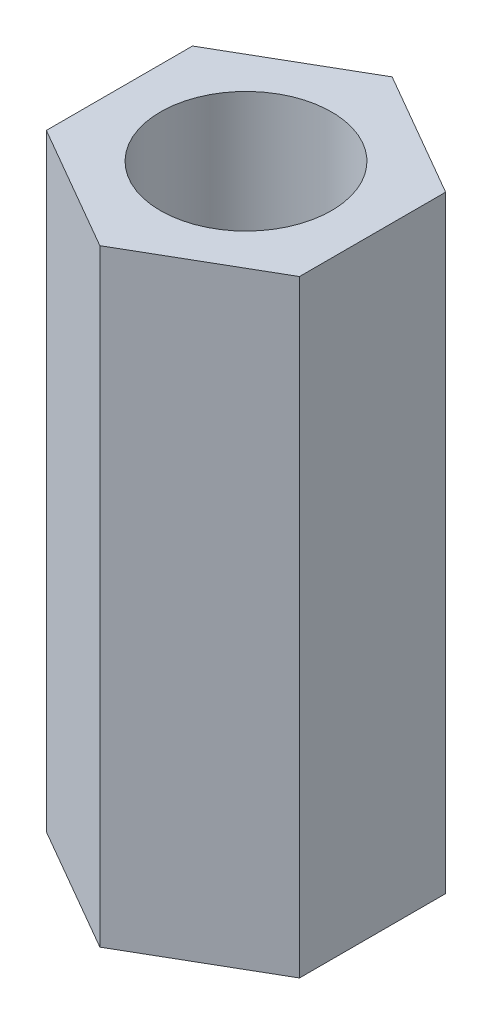
ISO-10303-21;
HEADER;
FILE_DESCRIPTION(('STEP AP214'),'2;1');
FILE_NAME('part.step','',(''),(''),'','','');
FILE_SCHEMA(('AUTOMOTIVE_DESIGN { 1 0 10303 214 1 1 1 1 }'));
ENDSEC;
DATA;
#1=APPLICATION_CONTEXT('core data for automotive mechanical design processes');
#2=APPLICATION_PROTOCOL_DEFINITION('international standard','automotive_design',2000,#1);
#3=PRODUCT_CONTEXT('',#1,'mechanical');
#4=PRODUCT('Part','Part','',(#3));
#5=PRODUCT_RELATED_PRODUCT_CATEGORY('part','',(#4));
#6=PRODUCT_DEFINITION_FORMATION('','',#4);
#7=PRODUCT_DEFINITION_CONTEXT('part definition',#1,'design');
#8=PRODUCT_DEFINITION('design','',#6,#7);
#9=PRODUCT_DEFINITION_SHAPE('','',#8);
#10=(LENGTH_UNIT() NAMED_UNIT(*) SI_UNIT(.MILLI.,.METRE.));
#11=(NAMED_UNIT(*) PLANE_ANGLE_UNIT() SI_UNIT($,.RADIAN.));
#12=(NAMED_UNIT(*) SI_UNIT($,.STERADIAN.) SOLID_ANGLE_UNIT());
#13=UNCERTAINTY_MEASURE_WITH_UNIT(LENGTH_MEASURE(1.E-05),#10,'distance_accuracy_value','');
#14=(GEOMETRIC_REPRESENTATION_CONTEXT(3) GLOBAL_UNCERTAINTY_ASSIGNED_CONTEXT((#13)) GLOBAL_UNIT_ASSIGNED_CONTEXT((#10,
#11,#12)) REPRESENTATION_CONTEXT('',''));
#15=CARTESIAN_POINT('',(0.,0.,0.));
#16=DIRECTION('',(0.,0.,1.));
#17=DIRECTION('',(1.,0.,0.));
#18=AXIS2_PLACEMENT_3D('',#15,#16,#17);
#19=CARTESIAN_POINT('',(0.,12.,0.));
#20=DIRECTION('',(0.,-1.,0.));
#21=DIRECTION('',(0.,0.,-1.));
#22=AXIS2_PLACEMENT_3D('',#19,#20,#21);
#23=PLANE('',#22);
#24=DIRECTION('',(-0.866025403784439,0.,0.5));
#25=VECTOR('',#24,1.);
#26=CARTESIAN_POINT('',(-2.50021534072567,12.,-1.4435));
#27=LINE('',#26,#25);
#28=CARTESIAN_POINT('',(0.,12.,-2.887));
#29=VERTEX_POINT('',#28);
#30=CARTESIAN_POINT('',(-2.50021534072567,12.,-1.4435));
#31=VERTEX_POINT('',#30);
#32=EDGE_CURVE('E129',#29,#31,#27,.T.);
#33=ORIENTED_EDGE('',*,*,#32,.T.);
#34=DIRECTION('',(0.,0.,1.));
#35=VECTOR('',#34,1.);
#36=CARTESIAN_POINT('',(-2.50021534072567,12.,1.4435));
#37=LINE('',#36,#35);
#38=CARTESIAN_POINT('',(-2.50021534072567,12.,1.4435));
#39=VERTEX_POINT('',#38);
#40=EDGE_CURVE('E87',#31,#39,#37,.T.);
#41=ORIENTED_EDGE('',*,*,#40,.T.);
#42=DIRECTION('',(0.866025403784439,0.,0.5));
#43=VECTOR('',#42,1.);
#44=CARTESIAN_POINT('',(0.,12.,2.887));
#45=LINE('',#44,#43);
#46=CARTESIAN_POINT('',(0.,12.,2.887));
#47=VERTEX_POINT('',#46);
#48=EDGE_CURVE('E100',#39,#47,#45,.T.);
#49=ORIENTED_EDGE('',*,*,#48,.T.);
#50=DIRECTION('',(0.866025403784439,0.,-0.5));
#51=VECTOR('',#50,1.);
#52=CARTESIAN_POINT('',(2.50021534072567,12.,1.4435));
#53=LINE('',#52,#51);
#54=CARTESIAN_POINT('',(2.50021534072567,12.,1.4435));
#55=VERTEX_POINT('',#54);
#56=EDGE_CURVE('E94',#47,#55,#53,.T.);
#57=ORIENTED_EDGE('',*,*,#56,.T.);
#58=DIRECTION('',(0.,0.,-1.));
#59=VECTOR('',#58,1.);
#60=CARTESIAN_POINT('',(2.50021534072567,12.,-1.4435));
#61=LINE('',#60,#59);
#62=CARTESIAN_POINT('',(2.50021534072567,12.,-1.4435));
#63=VERTEX_POINT('',#62);
#64=EDGE_CURVE('E98',#55,#63,#61,.T.);
#65=ORIENTED_EDGE('',*,*,#64,.T.);
#66=DIRECTION('',(-0.866025403784439,0.,-0.5));
#67=VECTOR('',#66,1.);
#68=CARTESIAN_POINT('',(0.,12.,-2.887));
#69=LINE('',#68,#67);
#70=EDGE_CURVE('E50',#63,#29,#69,.T.);
#71=ORIENTED_EDGE('',*,*,#70,.T.);
#72=EDGE_LOOP('',(#33,#41,#49,#57,#65,#71));
#73=FACE_BOUND('',#72,.T.);
#74=CARTESIAN_POINT('',(0.,12.,0.));
#75=DIRECTION('',(0.,1.,0.));
#76=DIRECTION('',(0.,0.,1.));
#77=AXIS2_PLACEMENT_3D('',#74,#75,#76);
#78=CIRCLE('',#77,1.69);
#79=CARTESIAN_POINT('',(0.,12.,1.69));
#80=VERTEX_POINT('',#79);
#81=EDGE_CURVE('E122',#80,#80,#78,.T.);
#82=ORIENTED_EDGE('',*,*,#81,.F.);
#83=EDGE_LOOP('',(#82));
#84=FACE_BOUND('',#83,.T.);
#85=ADVANCED_FACE('F33',(#73,#84),#23,.F.);
#86=CARTESIAN_POINT('',(0.,0.,0.));
#87=DIRECTION('',(0.,-1.,0.));
#88=DIRECTION('',(0.,0.,-1.));
#89=AXIS2_PLACEMENT_3D('',#86,#87,#88);
#90=PLANE('',#89);
#91=DIRECTION('',(-0.866025403784439,0.,0.5));
#92=VECTOR('',#91,1.);
#93=CARTESIAN_POINT('',(-2.50021534072567,0.,-1.4435));
#94=LINE('',#93,#92);
#95=CARTESIAN_POINT('',(0.,0.,-2.887));
#96=VERTEX_POINT('',#95);
#97=CARTESIAN_POINT('',(-2.50021534072567,0.,-1.4435));
#98=VERTEX_POINT('',#97);
#99=EDGE_CURVE('E118',#96,#98,#94,.T.);
#100=ORIENTED_EDGE('',*,*,#99,.F.);
#101=DIRECTION('',(-0.866025403784439,0.,-0.5));
#102=VECTOR('',#101,1.);
#103=CARTESIAN_POINT('',(0.,0.,-2.887));
#104=LINE('',#103,#102);
#105=CARTESIAN_POINT('',(2.50021534072567,0.,-1.4435));
#106=VERTEX_POINT('',#105);
#107=EDGE_CURVE('E79',#106,#96,#104,.T.);
#108=ORIENTED_EDGE('',*,*,#107,.F.);
#109=DIRECTION('',(0.,0.,-1.));
#110=VECTOR('',#109,1.);
#111=CARTESIAN_POINT('',(2.50021534072567,0.,-1.4435));
#112=LINE('',#111,#110);
#113=CARTESIAN_POINT('',(2.50021534072567,0.,1.4435));
#114=VERTEX_POINT('',#113);
#115=EDGE_CURVE('E73',#114,#106,#112,.T.);
#116=ORIENTED_EDGE('',*,*,#115,.F.);
#117=DIRECTION('',(0.866025403784439,0.,-0.5));
#118=VECTOR('',#117,1.);
#119=CARTESIAN_POINT('',(2.50021534072567,0.,1.4435));
#120=LINE('',#119,#118);
#121=CARTESIAN_POINT('',(0.,0.,2.887));
#122=VERTEX_POINT('',#121);
#123=EDGE_CURVE('E108',#122,#114,#120,.T.);
#124=ORIENTED_EDGE('',*,*,#123,.F.);
#125=DIRECTION('',(0.866025403784439,0.,0.5));
#126=VECTOR('',#125,1.);
#127=CARTESIAN_POINT('',(0.,0.,2.887));
#128=LINE('',#127,#126);
#129=CARTESIAN_POINT('',(-2.50021534072567,0.,1.4435));
#130=VERTEX_POINT('',#129);
#131=EDGE_CURVE('E124',#130,#122,#128,.T.);
#132=ORIENTED_EDGE('',*,*,#131,.F.);
#133=DIRECTION('',(0.,0.,1.));
#134=VECTOR('',#133,1.);
#135=CARTESIAN_POINT('',(-2.50021534072567,0.,1.4435));
#136=LINE('',#135,#134);
#137=EDGE_CURVE('E121',#98,#130,#136,.T.);
#138=ORIENTED_EDGE('',*,*,#137,.F.);
#139=EDGE_LOOP('',(#100,#108,#116,#124,#132,#138));
#140=FACE_BOUND('',#139,.T.);
#141=CARTESIAN_POINT('',(0.,0.,0.));
#142=DIRECTION('',(0.,1.,0.));
#143=DIRECTION('',(0.,0.,1.));
#144=AXIS2_PLACEMENT_3D('',#141,#142,#143);
#145=CIRCLE('',#144,1.69);
#146=CARTESIAN_POINT('',(0.,0.,1.69));
#147=VERTEX_POINT('',#146);
#148=EDGE_CURVE('E222',#147,#147,#145,.T.);
#149=ORIENTED_EDGE('',*,*,#148,.T.);
#150=EDGE_LOOP('',(#149));
#151=FACE_BOUND('',#150,.T.);
#152=ADVANCED_FACE('F138',(#140,#151),#90,.T.);
#153=CARTESIAN_POINT('',(-2.50021534072567,12.,-1.4435));
#154=DIRECTION('',(0.5,0.,0.866025403784439));
#155=DIRECTION('',(0.866025403784439,0.,-0.5));
#156=AXIS2_PLACEMENT_3D('',#153,#154,#155);
#157=PLANE('',#156);
#158=ORIENTED_EDGE('',*,*,#99,.T.);
#159=DIRECTION('',(0.,-1.,0.));
#160=VECTOR('',#159,1.);
#161=CARTESIAN_POINT('',(-2.50021534072567,12.,-1.4435));
#162=LINE('',#161,#160);
#163=EDGE_CURVE('E11',#31,#98,#162,.T.);
#164=ORIENTED_EDGE('',*,*,#163,.F.);
#165=ORIENTED_EDGE('',*,*,#32,.F.);
#166=DIRECTION('',(0.,-1.,0.));
#167=VECTOR('',#166,1.);
#168=CARTESIAN_POINT('',(0.,12.,-2.887));
#169=LINE('',#168,#167);
#170=EDGE_CURVE('E114',#29,#96,#169,.T.);
#171=ORIENTED_EDGE('',*,*,#170,.T.);
#172=EDGE_LOOP('',(#158,#164,#165,#171));
#173=FACE_BOUND('',#172,.T.);
#174=ADVANCED_FACE('F35',(#173),#157,.F.);
#175=CARTESIAN_POINT('',(-2.50021534072567,12.,1.4435));
#176=DIRECTION('',(1.,0.,0.));
#177=DIRECTION('',(0.,0.,-1.));
#178=AXIS2_PLACEMENT_3D('',#175,#176,#177);
#179=PLANE('',#178);
#180=ORIENTED_EDGE('',*,*,#137,.T.);
#181=DIRECTION('',(0.,-1.,0.));
#182=VECTOR('',#181,1.);
#183=CARTESIAN_POINT('',(-2.50021534072567,12.,1.4435));
#184=LINE('',#183,#182);
#185=EDGE_CURVE('E42',#39,#130,#184,.T.);
#186=ORIENTED_EDGE('',*,*,#185,.F.);
#187=ORIENTED_EDGE('',*,*,#40,.F.);
#188=ORIENTED_EDGE('',*,*,#163,.T.);
#189=EDGE_LOOP('',(#180,#186,#187,#188));
#190=FACE_BOUND('',#189,.T.);
#191=ADVANCED_FACE('F163',(#190),#179,.F.);
#192=CARTESIAN_POINT('',(0.,12.,2.887));
#193=DIRECTION('',(0.5,0.,-0.866025403784439));
#194=DIRECTION('',(-0.866025403784439,0.,-0.5));
#195=AXIS2_PLACEMENT_3D('',#192,#193,#194);
#196=PLANE('',#195);
#197=ORIENTED_EDGE('',*,*,#131,.T.);
#198=DIRECTION('',(0.,-1.,0.));
#199=VECTOR('',#198,1.);
#200=CARTESIAN_POINT('',(0.,12.,2.887));
#201=LINE('',#200,#199);
#202=EDGE_CURVE('E109',#47,#122,#201,.T.);
#203=ORIENTED_EDGE('',*,*,#202,.F.);
#204=ORIENTED_EDGE('',*,*,#48,.F.);
#205=ORIENTED_EDGE('',*,*,#185,.T.);
#206=EDGE_LOOP('',(#197,#203,#204,#205));
#207=FACE_BOUND('',#206,.T.);
#208=ADVANCED_FACE('F135',(#207),#196,.F.);
#209=CARTESIAN_POINT('',(2.50021534072567,12.,1.4435));
#210=DIRECTION('',(-0.5,0.,-0.866025403784438));
#211=DIRECTION('',(-0.866025403784439,0.,0.5));
#212=AXIS2_PLACEMENT_3D('',#209,#210,#211);
#213=PLANE('',#212);
#214=ORIENTED_EDGE('',*,*,#123,.T.);
#215=DIRECTION('',(0.,-1.,0.));
#216=VECTOR('',#215,1.);
#217=CARTESIAN_POINT('',(2.50021534072567,12.,1.4435));
#218=LINE('',#217,#216);
#219=EDGE_CURVE('E105',#55,#114,#218,.T.);
#220=ORIENTED_EDGE('',*,*,#219,.F.);
#221=ORIENTED_EDGE('',*,*,#56,.F.);
#222=ORIENTED_EDGE('',*,*,#202,.T.);
#223=EDGE_LOOP('',(#214,#220,#221,#222));
#224=FACE_BOUND('',#223,.T.);
#225=ADVANCED_FACE('F106',(#224),#213,.F.);
#226=CARTESIAN_POINT('',(2.50021534072567,12.,-1.4435));
#227=DIRECTION('',(-1.,0.,0.));
#228=DIRECTION('',(0.,0.,1.));
#229=AXIS2_PLACEMENT_3D('',#226,#227,#228);
#230=PLANE('',#229);
#231=ORIENTED_EDGE('',*,*,#115,.T.);
#232=DIRECTION('',(0.,-1.,0.));
#233=VECTOR('',#232,1.);
#234=CARTESIAN_POINT('',(2.50021534072567,12.,-1.4435));
#235=LINE('',#234,#233);
#236=EDGE_CURVE('E110',#63,#106,#235,.T.);
#237=ORIENTED_EDGE('',*,*,#236,.F.);
#238=ORIENTED_EDGE('',*,*,#64,.F.);
#239=ORIENTED_EDGE('',*,*,#219,.T.);
#240=EDGE_LOOP('',(#231,#237,#238,#239));
#241=FACE_BOUND('',#240,.T.);
#242=ADVANCED_FACE('F112',(#241),#230,.F.);
#243=CARTESIAN_POINT('',(0.,12.,-2.887));
#244=DIRECTION('',(-0.5,0.,0.866025403784438));
#245=DIRECTION('',(0.866025403784439,0.,0.5));
#246=AXIS2_PLACEMENT_3D('',#243,#244,#245);
#247=PLANE('',#246);
#248=ORIENTED_EDGE('',*,*,#107,.T.);
#249=ORIENTED_EDGE('',*,*,#170,.F.);
#250=ORIENTED_EDGE('',*,*,#70,.F.);
#251=ORIENTED_EDGE('',*,*,#236,.T.);
#252=EDGE_LOOP('',(#248,#249,#250,#251));
#253=FACE_BOUND('',#252,.T.);
#254=ADVANCED_FACE('F143',(#253),#247,.F.);
#255=CARTESIAN_POINT('',(0.,12.,0.));
#256=DIRECTION('',(0.,-1.,0.));
#257=DIRECTION('',(0.,0.,-1.));
#258=AXIS2_PLACEMENT_3D('',#255,#256,#257);
#259=CYLINDRICAL_SURFACE('',#258,1.69);
#260=ORIENTED_EDGE('',*,*,#81,.T.);
#261=EDGE_LOOP('',(#260));
#262=FACE_BOUND('',#261,.T.);
#263=ORIENTED_EDGE('',*,*,#148,.F.);
#264=EDGE_LOOP('',(#263));
#265=FACE_BOUND('',#264,.T.);
#266=ADVANCED_FACE('F145',(#262,#265),#259,.F.);
#267=CLOSED_SHELL('',(#85,#152,#174,#191,#208,#225,#242,#254,#266));
#268=MANIFOLD_SOLID_BREP('B2',#267);
#269=ADVANCED_BREP_SHAPE_REPRESENTATION('',(#18,#268),#14);
#270=SHAPE_DEFINITION_REPRESENTATION(#9,#269);
ENDSEC;
END-ISO-10303-21;
